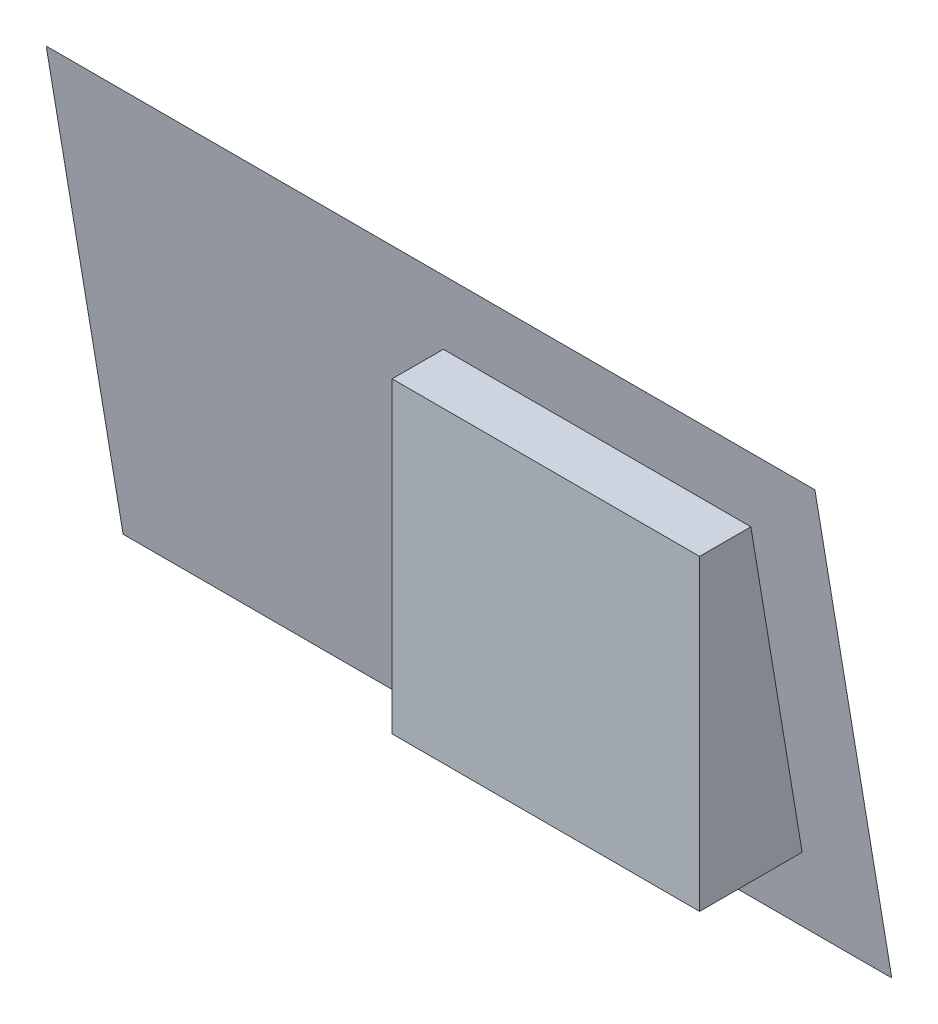
ISO-10303-21;
HEADER;
FILE_DESCRIPTION(('STEP AP214'),'2;1');
FILE_NAME('part.step','',(''),(''),'','','');
FILE_SCHEMA(('AUTOMOTIVE_DESIGN { 1 0 10303 214 1 1 1 1 }'));
ENDSEC;
DATA;
#1=APPLICATION_CONTEXT('core data for automotive mechanical design processes');
#2=APPLICATION_PROTOCOL_DEFINITION('international standard','automotive_design',2000,#1);
#3=PRODUCT_CONTEXT('',#1,'mechanical');
#4=PRODUCT('Part','Part','',(#3));
#5=PRODUCT_RELATED_PRODUCT_CATEGORY('part','',(#4));
#6=PRODUCT_DEFINITION_FORMATION('','',#4);
#7=PRODUCT_DEFINITION_CONTEXT('part definition',#1,'design');
#8=PRODUCT_DEFINITION('design','',#6,#7);
#9=PRODUCT_DEFINITION_SHAPE('','',#8);
#10=(LENGTH_UNIT() NAMED_UNIT(*) SI_UNIT(.MILLI.,.METRE.));
#11=(NAMED_UNIT(*) PLANE_ANGLE_UNIT() SI_UNIT($,.RADIAN.));
#12=(NAMED_UNIT(*) SI_UNIT($,.STERADIAN.) SOLID_ANGLE_UNIT());
#13=UNCERTAINTY_MEASURE_WITH_UNIT(LENGTH_MEASURE(1.E-05),#10,'distance_accuracy_value','');
#14=(GEOMETRIC_REPRESENTATION_CONTEXT(3) GLOBAL_UNCERTAINTY_ASSIGNED_CONTEXT((#13)) GLOBAL_UNIT_ASSIGNED_CONTEXT((#10,
#11,#12)) REPRESENTATION_CONTEXT('',''));
#15=CARTESIAN_POINT('',(0.,0.,0.));
#16=DIRECTION('',(0.,0.,1.));
#17=DIRECTION('',(1.,0.,0.));
#18=AXIS2_PLACEMENT_3D('',#15,#16,#17);
#19=CARTESIAN_POINT('',(0.,-10.,5.));
#20=DIRECTION('',(0.,0.164398987305357,-0.986393923832144));
#21=DIRECTION('',(0.,0.986393923832144,0.164398987305357));
#22=AXIS2_PLACEMENT_3D('',#19,#20,#21);
#23=PLANE('',#22);
#24=DIRECTION('',(0.,0.986393923832144,0.164398987305357));
#25=VECTOR('',#24,1.);
#26=CARTESIAN_POINT('',(50.,-10.,5.));
#27=LINE('',#26,#25);
#28=CARTESIAN_POINT('',(50.,-10.,5.));
#29=VERTEX_POINT('',#28);
#30=CARTESIAN_POINT('',(50.,50.,15.));
#31=VERTEX_POINT('',#30);
#32=EDGE_CURVE('E56',#29,#31,#27,.T.);
#33=ORIENTED_EDGE('',*,*,#32,.F.);
#34=DIRECTION('',(1.,0.,0.));
#35=VECTOR('',#34,1.);
#36=CARTESIAN_POINT('',(0.,-10.,5.));
#37=LINE('',#36,#35);
#38=CARTESIAN_POINT('',(-50.,-10.,5.));
#39=VERTEX_POINT('',#38);
#40=EDGE_CURVE('E48',#39,#29,#37,.T.);
#41=ORIENTED_EDGE('',*,*,#40,.F.);
#42=DIRECTION('',(0.,0.986393923832144,0.164398987305357));
#43=VECTOR('',#42,1.);
#44=CARTESIAN_POINT('',(-50.,-10.,5.));
#45=LINE('',#44,#43);
#46=CARTESIAN_POINT('',(-50.,50.,15.));
#47=VERTEX_POINT('',#46);
#48=EDGE_CURVE('E66',#39,#47,#45,.T.);
#49=ORIENTED_EDGE('',*,*,#48,.T.);
#50=DIRECTION('',(1.,0.,0.));
#51=VECTOR('',#50,1.);
#52=CARTESIAN_POINT('',(0.,50.,15.));
#53=LINE('',#52,#51);
#54=EDGE_CURVE('E12',#47,#31,#53,.T.);
#55=ORIENTED_EDGE('',*,*,#54,.T.);
#56=EDGE_LOOP('',(#33,#41,#49,#55));
#57=FACE_BOUND('',#56,.T.);
#58=ADVANCED_FACE('F47',(#57),#23,.T.);
#59=OPEN_SHELL('',(#58));
#60=SHELL_BASED_SURFACE_MODEL('B2',(#59));
#61=CARTESIAN_POINT('',(0.,0.,20.));
#62=DIRECTION('',(1.,0.,0.));
#63=DIRECTION('',(0.,0.,-1.));
#64=AXIS2_PLACEMENT_3D('',#61,#62,#63);
#65=PLANE('',#64);
#66=DIRECTION('',(0.,0.986393923832144,0.164398987305357));
#67=VECTOR('',#66,1.);
#68=CARTESIAN_POINT('',(0.,2.16216216216216,7.02702702702703));
#69=LINE('',#68,#67);
#70=CARTESIAN_POINT('',(0.,0.,6.66666666666667));
#71=VERTEX_POINT('',#70);
#72=CARTESIAN_POINT('',(0.,40.,13.3333333333333));
#73=VERTEX_POINT('',#72);
#74=EDGE_CURVE('E105',#71,#73,#69,.T.);
#75=ORIENTED_EDGE('',*,*,#74,.F.);
#76=DIRECTION('',(0.,0.,-1.));
#77=VECTOR('',#76,1.);
#78=CARTESIAN_POINT('',(0.,0.,20.));
#79=LINE('',#78,#77);
#80=CARTESIAN_POINT('',(0.,0.,20.));
#81=VERTEX_POINT('',#80);
#82=EDGE_CURVE('E98',#81,#71,#79,.T.);
#83=ORIENTED_EDGE('',*,*,#82,.F.);
#84=DIRECTION('',(0.,-1.,0.));
#85=VECTOR('',#84,1.);
#86=CARTESIAN_POINT('',(0.,0.,20.));
#87=LINE('',#86,#85);
#88=CARTESIAN_POINT('',(0.,40.,20.));
#89=VERTEX_POINT('',#88);
#90=EDGE_CURVE('E150',#89,#81,#87,.T.);
#91=ORIENTED_EDGE('',*,*,#90,.F.);
#92=DIRECTION('',(0.,0.,-1.));
#93=VECTOR('',#92,1.);
#94=CARTESIAN_POINT('',(0.,40.,20.));
#95=LINE('',#94,#93);
#96=EDGE_CURVE('E142',#89,#73,#95,.T.);
#97=ORIENTED_EDGE('',*,*,#96,.T.);
#98=EDGE_LOOP('',(#75,#83,#91,#97));
#99=FACE_BOUND('',#98,.T.);
#100=ADVANCED_FACE('F91',(#99),#65,.F.);
#101=CARTESIAN_POINT('',(0.,0.,20.));
#102=DIRECTION('',(0.,1.,0.));
#103=DIRECTION('',(0.,0.,1.));
#104=AXIS2_PLACEMENT_3D('',#101,#102,#103);
#105=PLANE('',#104);
#106=DIRECTION('',(-1.,0.,0.));
#107=VECTOR('',#106,1.);
#108=CARTESIAN_POINT('',(0.,0.,6.66666666666667));
#109=LINE('',#108,#107);
#110=CARTESIAN_POINT('',(40.,0.,6.66666666666667));
#111=VERTEX_POINT('',#110);
#112=EDGE_CURVE('E112',#111,#71,#109,.T.);
#113=ORIENTED_EDGE('',*,*,#112,.F.);
#114=DIRECTION('',(0.,0.,-1.));
#115=VECTOR('',#114,1.);
#116=CARTESIAN_POINT('',(40.,0.,20.));
#117=LINE('',#116,#115);
#118=CARTESIAN_POINT('',(40.,0.,20.));
#119=VERTEX_POINT('',#118);
#120=EDGE_CURVE('E141',#119,#111,#117,.T.);
#121=ORIENTED_EDGE('',*,*,#120,.F.);
#122=DIRECTION('',(1.,0.,0.));
#123=VECTOR('',#122,1.);
#124=CARTESIAN_POINT('',(0.,0.,20.));
#125=LINE('',#124,#123);
#126=EDGE_CURVE('E153',#81,#119,#125,.T.);
#127=ORIENTED_EDGE('',*,*,#126,.F.);
#128=ORIENTED_EDGE('',*,*,#82,.T.);
#129=EDGE_LOOP('',(#113,#121,#127,#128));
#130=FACE_BOUND('',#129,.T.);
#131=ADVANCED_FACE('F162',(#130),#105,.F.);
#132=CARTESIAN_POINT('',(40.,0.,20.));
#133=DIRECTION('',(-1.,0.,0.));
#134=DIRECTION('',(0.,0.,1.));
#135=AXIS2_PLACEMENT_3D('',#132,#133,#134);
#136=PLANE('',#135);
#137=DIRECTION('',(0.,-0.986393923832144,-0.164398987305357));
#138=VECTOR('',#137,1.);
#139=CARTESIAN_POINT('',(40.,2.16216216216216,7.02702702702703));
#140=LINE('',#139,#138);
#141=CARTESIAN_POINT('',(40.,40.,13.3333333333333));
#142=VERTEX_POINT('',#141);
#143=EDGE_CURVE('E145',#142,#111,#140,.T.);
#144=ORIENTED_EDGE('',*,*,#143,.F.);
#145=DIRECTION('',(0.,0.,-1.));
#146=VECTOR('',#145,1.);
#147=CARTESIAN_POINT('',(40.,40.,20.));
#148=LINE('',#147,#146);
#149=CARTESIAN_POINT('',(40.,40.,20.));
#150=VERTEX_POINT('',#149);
#151=EDGE_CURVE('E134',#150,#142,#148,.T.);
#152=ORIENTED_EDGE('',*,*,#151,.F.);
#153=DIRECTION('',(0.,1.,0.));
#154=VECTOR('',#153,1.);
#155=CARTESIAN_POINT('',(40.,0.,20.));
#156=LINE('',#155,#154);
#157=EDGE_CURVE('E158',#119,#150,#156,.T.);
#158=ORIENTED_EDGE('',*,*,#157,.F.);
#159=ORIENTED_EDGE('',*,*,#120,.T.);
#160=EDGE_LOOP('',(#144,#152,#158,#159));
#161=FACE_BOUND('',#160,.T.);
#162=ADVANCED_FACE('F146',(#161),#136,.F.);
#163=CARTESIAN_POINT('',(0.,40.,20.));
#164=DIRECTION('',(0.,-1.,0.));
#165=DIRECTION('',(0.,0.,-1.));
#166=AXIS2_PLACEMENT_3D('',#163,#164,#165);
#167=PLANE('',#166);
#168=DIRECTION('',(1.,0.,0.));
#169=VECTOR('',#168,1.);
#170=CARTESIAN_POINT('',(0.,40.,13.3333333333333));
#171=LINE('',#170,#169);
#172=EDGE_CURVE('E45',#73,#142,#171,.T.);
#173=ORIENTED_EDGE('',*,*,#172,.F.);
#174=ORIENTED_EDGE('',*,*,#96,.F.);
#175=DIRECTION('',(-1.,0.,0.));
#176=VECTOR('',#175,1.);
#177=CARTESIAN_POINT('',(0.,40.,20.));
#178=LINE('',#177,#176);
#179=EDGE_CURVE('E138',#150,#89,#178,.T.);
#180=ORIENTED_EDGE('',*,*,#179,.F.);
#181=ORIENTED_EDGE('',*,*,#151,.T.);
#182=EDGE_LOOP('',(#173,#174,#180,#181));
#183=FACE_BOUND('',#182,.T.);
#184=ADVANCED_FACE('F136',(#183),#167,.F.);
#185=CARTESIAN_POINT('',(0.,0.,20.));
#186=DIRECTION('',(0.,0.,-1.));
#187=DIRECTION('',(-1.,0.,0.));
#188=AXIS2_PLACEMENT_3D('',#185,#186,#187);
#189=PLANE('',#188);
#190=ORIENTED_EDGE('',*,*,#90,.T.);
#191=ORIENTED_EDGE('',*,*,#126,.T.);
#192=ORIENTED_EDGE('',*,*,#157,.T.);
#193=ORIENTED_EDGE('',*,*,#179,.T.);
#194=EDGE_LOOP('',(#190,#191,#192,#193));
#195=FACE_BOUND('',#194,.T.);
#196=ADVANCED_FACE('F165',(#195),#189,.F.);
#197=CARTESIAN_POINT('',(0.,-10.,5.));
#198=DIRECTION('',(0.,0.164398987305357,-0.986393923832144));
#199=DIRECTION('',(0.,0.986393923832144,0.164398987305357));
#200=AXIS2_PLACEMENT_3D('',#197,#198,#199);
#201=PLANE('',#200);
#202=ORIENTED_EDGE('',*,*,#112,.T.);
#203=ORIENTED_EDGE('',*,*,#74,.T.);
#204=ORIENTED_EDGE('',*,*,#172,.T.);
#205=ORIENTED_EDGE('',*,*,#143,.T.);
#206=EDGE_LOOP('',(#202,#203,#204,#205));
#207=FACE_BOUND('',#206,.T.);
#208=ADVANCED_FACE('F149',(#207),#201,.T.);
#209=CLOSED_SHELL('',(#100,#131,#162,#184,#196,#208));
#210=MANIFOLD_SOLID_BREP('B6',#209);
#211=ADVANCED_BREP_SHAPE_REPRESENTATION('',(#18,#210),#14);
#212=MANIFOLD_SURFACE_SHAPE_REPRESENTATION('',(#18,#60),#14);
#213=SHAPE_REPRESENTATION('',(#18),#14);
#214=SHAPE_DEFINITION_REPRESENTATION(#9,#213);
#215=SHAPE_REPRESENTATION_RELATIONSHIP('','',#213,#211);
#216=SHAPE_REPRESENTATION_RELATIONSHIP('','',#213,#212);
ENDSEC;
END-ISO-10303-21;
